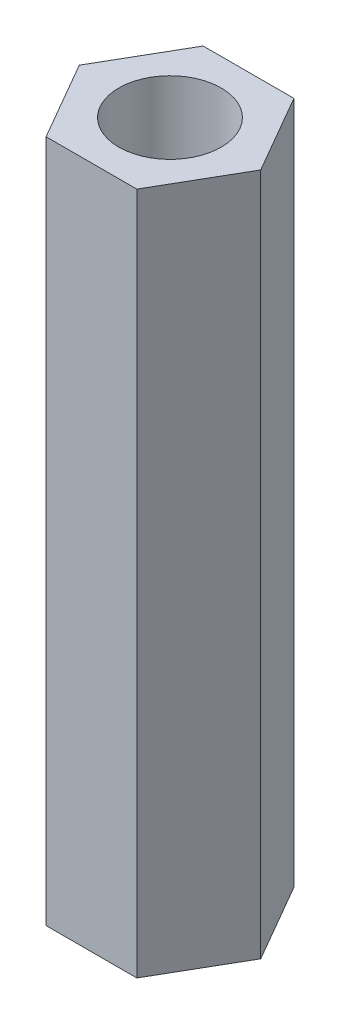
ISO-10303-21;
HEADER;
FILE_DESCRIPTION(('STEP AP214'),'2;1');
FILE_NAME('part.step','',(''),(''),'','','');
FILE_SCHEMA(('AUTOMOTIVE_DESIGN { 1 0 10303 214 1 1 1 1 }'));
ENDSEC;
DATA;
#1=APPLICATION_CONTEXT('core data for automotive mechanical design processes');
#2=APPLICATION_PROTOCOL_DEFINITION('international standard','automotive_design',2000,#1);
#3=PRODUCT_CONTEXT('',#1,'mechanical');
#4=PRODUCT('Part','Part','',(#3));
#5=PRODUCT_RELATED_PRODUCT_CATEGORY('part','',(#4));
#6=PRODUCT_DEFINITION_FORMATION('','',#4);
#7=PRODUCT_DEFINITION_CONTEXT('part definition',#1,'design');
#8=PRODUCT_DEFINITION('design','',#6,#7);
#9=PRODUCT_DEFINITION_SHAPE('','',#8);
#10=(LENGTH_UNIT() NAMED_UNIT(*) SI_UNIT(.MILLI.,.METRE.));
#11=(NAMED_UNIT(*) PLANE_ANGLE_UNIT() SI_UNIT($,.RADIAN.));
#12=(NAMED_UNIT(*) SI_UNIT($,.STERADIAN.) SOLID_ANGLE_UNIT());
#13=UNCERTAINTY_MEASURE_WITH_UNIT(LENGTH_MEASURE(1.E-05),#10,'distance_accuracy_value','');
#14=(GEOMETRIC_REPRESENTATION_CONTEXT(3) GLOBAL_UNCERTAINTY_ASSIGNED_CONTEXT((#13)) GLOBAL_UNIT_ASSIGNED_CONTEXT((#10,
#11,#12)) REPRESENTATION_CONTEXT('',''));
#15=CARTESIAN_POINT('',(0.,0.,0.));
#16=DIRECTION('',(0.,0.,1.));
#17=DIRECTION('',(1.,0.,0.));
#18=AXIS2_PLACEMENT_3D('',#15,#16,#17);
#19=CARTESIAN_POINT('',(0.,20.,0.));
#20=DIRECTION('',(0.,1.,0.));
#21=DIRECTION('',(0.,0.,1.));
#22=AXIS2_PLACEMENT_3D('',#19,#20,#21);
#23=PLANE('',#22);
#24=DIRECTION('',(1.,0.,0.));
#25=VECTOR('',#24,1.);
#26=CARTESIAN_POINT('',(-1.32790561913614,20.,2.3));
#27=LINE('',#26,#25);
#28=CARTESIAN_POINT('',(-1.32790561913614,20.,2.3));
#29=VERTEX_POINT('',#28);
#30=CARTESIAN_POINT('',(1.32790561913614,20.,2.3));
#31=VERTEX_POINT('',#30);
#32=EDGE_CURVE('E140',#29,#31,#27,.T.);
#33=ORIENTED_EDGE('',*,*,#32,.T.);
#34=DIRECTION('',(0.5,0.,-0.866025403784439));
#35=VECTOR('',#34,1.);
#36=CARTESIAN_POINT('',(1.32790561913614,20.,2.3));
#37=LINE('',#36,#35);
#38=CARTESIAN_POINT('',(2.65581123827228,20.,0.));
#39=VERTEX_POINT('',#38);
#40=EDGE_CURVE('E92',#31,#39,#37,.T.);
#41=ORIENTED_EDGE('',*,*,#40,.T.);
#42=DIRECTION('',(-0.5,0.,-0.866025403784438));
#43=VECTOR('',#42,1.);
#44=CARTESIAN_POINT('',(2.65581123827228,20.,0.));
#45=LINE('',#44,#43);
#46=CARTESIAN_POINT('',(1.32790561913614,20.,-2.3));
#47=VERTEX_POINT('',#46);
#48=EDGE_CURVE('E107',#39,#47,#45,.T.);
#49=ORIENTED_EDGE('',*,*,#48,.T.);
#50=DIRECTION('',(-1.,0.,0.));
#51=VECTOR('',#50,1.);
#52=CARTESIAN_POINT('',(1.32790561913614,20.,-2.3));
#53=LINE('',#52,#51);
#54=CARTESIAN_POINT('',(-1.32790561913614,20.,-2.3));
#55=VERTEX_POINT('',#54);
#56=EDGE_CURVE('E105',#47,#55,#53,.T.);
#57=ORIENTED_EDGE('',*,*,#56,.T.);
#58=DIRECTION('',(-0.5,0.,0.866025403784439));
#59=VECTOR('',#58,1.);
#60=CARTESIAN_POINT('',(-1.32790561913614,20.,-2.3));
#61=LINE('',#60,#59);
#62=CARTESIAN_POINT('',(-2.65581123827228,20.,0.));
#63=VERTEX_POINT('',#62);
#64=EDGE_CURVE('E106',#55,#63,#61,.T.);
#65=ORIENTED_EDGE('',*,*,#64,.T.);
#66=DIRECTION('',(0.5,0.,0.866025403784439));
#67=VECTOR('',#66,1.);
#68=CARTESIAN_POINT('',(-2.65581123827228,20.,0.));
#69=LINE('',#68,#67);
#70=EDGE_CURVE('E59',#63,#29,#69,.T.);
#71=ORIENTED_EDGE('',*,*,#70,.T.);
#72=EDGE_LOOP('',(#33,#41,#49,#57,#65,#71));
#73=FACE_BOUND('',#72,.T.);
#74=CARTESIAN_POINT('',(0.,20.,0.));
#75=DIRECTION('',(0.,1.,0.));
#76=DIRECTION('',(0.,0.,1.));
#77=AXIS2_PLACEMENT_3D('',#74,#75,#76);
#78=CIRCLE('',#77,1.5);
#79=CARTESIAN_POINT('',(0.,20.,1.5));
#80=VERTEX_POINT('',#79);
#81=EDGE_CURVE('E128',#80,#80,#78,.T.);
#82=ORIENTED_EDGE('',*,*,#81,.F.);
#83=EDGE_LOOP('',(#82));
#84=FACE_BOUND('',#83,.T.);
#85=ADVANCED_FACE('F41',(#73,#84),#23,.T.);
#86=CARTESIAN_POINT('',(0.,0.,0.));
#87=DIRECTION('',(0.,1.,0.));
#88=DIRECTION('',(0.,0.,1.));
#89=AXIS2_PLACEMENT_3D('',#86,#87,#88);
#90=PLANE('',#89);
#91=DIRECTION('',(1.,0.,0.));
#92=VECTOR('',#91,1.);
#93=CARTESIAN_POINT('',(-1.32790561913614,0.,2.3));
#94=LINE('',#93,#92);
#95=CARTESIAN_POINT('',(-1.32790561913614,0.,2.3));
#96=VERTEX_POINT('',#95);
#97=CARTESIAN_POINT('',(1.32790561913614,0.,2.3));
#98=VERTEX_POINT('',#97);
#99=EDGE_CURVE('E127',#96,#98,#94,.T.);
#100=ORIENTED_EDGE('',*,*,#99,.F.);
#101=DIRECTION('',(0.5,0.,0.866025403784439));
#102=VECTOR('',#101,1.);
#103=CARTESIAN_POINT('',(-2.65581123827228,0.,0.));
#104=LINE('',#103,#102);
#105=CARTESIAN_POINT('',(-2.65581123827228,0.,0.));
#106=VERTEX_POINT('',#105);
#107=EDGE_CURVE('E87',#106,#96,#104,.T.);
#108=ORIENTED_EDGE('',*,*,#107,.F.);
#109=DIRECTION('',(-0.5,0.,0.866025403784439));
#110=VECTOR('',#109,1.);
#111=CARTESIAN_POINT('',(-1.32790561913614,0.,-2.3));
#112=LINE('',#111,#110);
#113=CARTESIAN_POINT('',(-1.32790561913614,0.,-2.3));
#114=VERTEX_POINT('',#113);
#115=EDGE_CURVE('E81',#114,#106,#112,.T.);
#116=ORIENTED_EDGE('',*,*,#115,.F.);
#117=DIRECTION('',(-1.,0.,0.));
#118=VECTOR('',#117,1.);
#119=CARTESIAN_POINT('',(1.32790561913614,0.,-2.3));
#120=LINE('',#119,#118);
#121=CARTESIAN_POINT('',(1.32790561913614,0.,-2.3));
#122=VERTEX_POINT('',#121);
#123=EDGE_CURVE('E118',#122,#114,#120,.T.);
#124=ORIENTED_EDGE('',*,*,#123,.F.);
#125=DIRECTION('',(-0.5,0.,-0.866025403784438));
#126=VECTOR('',#125,1.);
#127=CARTESIAN_POINT('',(2.65581123827228,0.,0.));
#128=LINE('',#127,#126);
#129=CARTESIAN_POINT('',(2.65581123827228,0.,0.));
#130=VERTEX_POINT('',#129);
#131=EDGE_CURVE('E134',#130,#122,#128,.T.);
#132=ORIENTED_EDGE('',*,*,#131,.F.);
#133=DIRECTION('',(0.5,0.,-0.866025403784439));
#134=VECTOR('',#133,1.);
#135=CARTESIAN_POINT('',(1.32790561913614,0.,2.3));
#136=LINE('',#135,#134);
#137=EDGE_CURVE('E129',#98,#130,#136,.T.);
#138=ORIENTED_EDGE('',*,*,#137,.F.);
#139=EDGE_LOOP('',(#100,#108,#116,#124,#132,#138));
#140=FACE_BOUND('',#139,.T.);
#141=CARTESIAN_POINT('',(0.,0.,0.));
#142=DIRECTION('',(0.,1.,0.));
#143=DIRECTION('',(0.,0.,1.));
#144=AXIS2_PLACEMENT_3D('',#141,#142,#143);
#145=CIRCLE('',#144,1.5);
#146=CARTESIAN_POINT('',(0.,0.,1.5));
#147=VERTEX_POINT('',#146);
#148=EDGE_CURVE('E226',#147,#147,#145,.T.);
#149=ORIENTED_EDGE('',*,*,#148,.T.);
#150=EDGE_LOOP('',(#149));
#151=FACE_BOUND('',#150,.T.);
#152=ADVANCED_FACE('F148',(#140,#151),#90,.F.);
#153=CARTESIAN_POINT('',(-1.32790561913614,20.,2.3));
#154=DIRECTION('',(0.,0.,-1.));
#155=DIRECTION('',(-1.,0.,0.));
#156=AXIS2_PLACEMENT_3D('',#153,#154,#155);
#157=PLANE('',#156);
#158=ORIENTED_EDGE('',*,*,#99,.T.);
#159=DIRECTION('',(0.,-1.,0.));
#160=VECTOR('',#159,1.);
#161=CARTESIAN_POINT('',(1.32790561913614,20.,2.3));
#162=LINE('',#161,#160);
#163=EDGE_CURVE('E11',#31,#98,#162,.T.);
#164=ORIENTED_EDGE('',*,*,#163,.F.);
#165=ORIENTED_EDGE('',*,*,#32,.F.);
#166=DIRECTION('',(0.,-1.,0.));
#167=VECTOR('',#166,1.);
#168=CARTESIAN_POINT('',(-1.32790561913614,20.,2.3));
#169=LINE('',#168,#167);
#170=EDGE_CURVE('E125',#29,#96,#169,.T.);
#171=ORIENTED_EDGE('',*,*,#170,.T.);
#172=EDGE_LOOP('',(#158,#164,#165,#171));
#173=FACE_BOUND('',#172,.T.);
#174=ADVANCED_FACE('F43',(#173),#157,.F.);
#175=CARTESIAN_POINT('',(1.32790561913614,20.,2.3));
#176=DIRECTION('',(-0.866025403784439,0.,-0.5));
#177=DIRECTION('',(-0.5,0.,0.866025403784439));
#178=AXIS2_PLACEMENT_3D('',#175,#176,#177);
#179=PLANE('',#178);
#180=ORIENTED_EDGE('',*,*,#137,.T.);
#181=DIRECTION('',(0.,-1.,0.));
#182=VECTOR('',#181,1.);
#183=CARTESIAN_POINT('',(2.65581123827228,20.,0.));
#184=LINE('',#183,#182);
#185=EDGE_CURVE('E49',#39,#130,#184,.T.);
#186=ORIENTED_EDGE('',*,*,#185,.F.);
#187=ORIENTED_EDGE('',*,*,#40,.F.);
#188=ORIENTED_EDGE('',*,*,#163,.T.);
#189=EDGE_LOOP('',(#180,#186,#187,#188));
#190=FACE_BOUND('',#189,.T.);
#191=ADVANCED_FACE('F173',(#190),#179,.F.);
#192=CARTESIAN_POINT('',(2.65581123827228,20.,0.));
#193=DIRECTION('',(-0.866025403784438,0.,0.5));
#194=DIRECTION('',(0.5,0.,0.866025403784439));
#195=AXIS2_PLACEMENT_3D('',#192,#193,#194);
#196=PLANE('',#195);
#197=ORIENTED_EDGE('',*,*,#131,.T.);
#198=DIRECTION('',(0.,-1.,0.));
#199=VECTOR('',#198,1.);
#200=CARTESIAN_POINT('',(1.32790561913614,20.,-2.3));
#201=LINE('',#200,#199);
#202=EDGE_CURVE('E119',#47,#122,#201,.T.);
#203=ORIENTED_EDGE('',*,*,#202,.F.);
#204=ORIENTED_EDGE('',*,*,#48,.F.);
#205=ORIENTED_EDGE('',*,*,#185,.T.);
#206=EDGE_LOOP('',(#197,#203,#204,#205));
#207=FACE_BOUND('',#206,.T.);
#208=ADVANCED_FACE('F141',(#207),#196,.F.);
#209=CARTESIAN_POINT('',(1.32790561913614,20.,-2.3));
#210=DIRECTION('',(0.,0.,1.));
#211=DIRECTION('',(1.,0.,0.));
#212=AXIS2_PLACEMENT_3D('',#209,#210,#211);
#213=PLANE('',#212);
#214=ORIENTED_EDGE('',*,*,#123,.T.);
#215=DIRECTION('',(0.,-1.,0.));
#216=VECTOR('',#215,1.);
#217=CARTESIAN_POINT('',(-1.32790561913614,20.,-2.3));
#218=LINE('',#217,#216);
#219=EDGE_CURVE('E114',#55,#114,#218,.T.);
#220=ORIENTED_EDGE('',*,*,#219,.F.);
#221=ORIENTED_EDGE('',*,*,#56,.F.);
#222=ORIENTED_EDGE('',*,*,#202,.T.);
#223=EDGE_LOOP('',(#214,#220,#221,#222));
#224=FACE_BOUND('',#223,.T.);
#225=ADVANCED_FACE('F111',(#224),#213,.F.);
#226=CARTESIAN_POINT('',(-1.32790561913614,20.,-2.3));
#227=DIRECTION('',(0.866025403784439,0.,0.5));
#228=DIRECTION('',(0.5,0.,-0.866025403784439));
#229=AXIS2_PLACEMENT_3D('',#226,#227,#228);
#230=PLANE('',#229);
#231=ORIENTED_EDGE('',*,*,#115,.T.);
#232=DIRECTION('',(0.,-1.,0.));
#233=VECTOR('',#232,1.);
#234=CARTESIAN_POINT('',(-2.65581123827228,20.,0.));
#235=LINE('',#234,#233);
#236=EDGE_CURVE('E117',#63,#106,#235,.T.);
#237=ORIENTED_EDGE('',*,*,#236,.F.);
#238=ORIENTED_EDGE('',*,*,#64,.F.);
#239=ORIENTED_EDGE('',*,*,#219,.T.);
#240=EDGE_LOOP('',(#231,#237,#238,#239));
#241=FACE_BOUND('',#240,.T.);
#242=ADVANCED_FACE('F116',(#241),#230,.F.);
#243=CARTESIAN_POINT('',(-2.65581123827228,20.,0.));
#244=DIRECTION('',(0.866025403784438,0.,-0.5));
#245=DIRECTION('',(-0.5,0.,-0.866025403784439));
#246=AXIS2_PLACEMENT_3D('',#243,#244,#245);
#247=PLANE('',#246);
#248=ORIENTED_EDGE('',*,*,#107,.T.);
#249=ORIENTED_EDGE('',*,*,#170,.F.);
#250=ORIENTED_EDGE('',*,*,#70,.F.);
#251=ORIENTED_EDGE('',*,*,#236,.T.);
#252=EDGE_LOOP('',(#248,#249,#250,#251));
#253=FACE_BOUND('',#252,.T.);
#254=ADVANCED_FACE('F151',(#253),#247,.F.);
#255=CARTESIAN_POINT('',(0.,20.,0.));
#256=DIRECTION('',(0.,-1.,0.));
#257=DIRECTION('',(0.,0.,-1.));
#258=AXIS2_PLACEMENT_3D('',#255,#256,#257);
#259=CYLINDRICAL_SURFACE('',#258,1.5);
#260=ORIENTED_EDGE('',*,*,#81,.T.);
#261=EDGE_LOOP('',(#260));
#262=FACE_BOUND('',#261,.T.);
#263=ORIENTED_EDGE('',*,*,#148,.F.);
#264=EDGE_LOOP('',(#263));
#265=FACE_BOUND('',#264,.T.);
#266=ADVANCED_FACE('F153',(#262,#265),#259,.F.);
#267=CLOSED_SHELL('',(#85,#152,#174,#191,#208,#225,#242,#254,#266));
#268=MANIFOLD_SOLID_BREP('B2',#267);
#269=ADVANCED_BREP_SHAPE_REPRESENTATION('',(#18,#268),#14);
#270=SHAPE_DEFINITION_REPRESENTATION(#9,#269);
ENDSEC;
END-ISO-10303-21;
